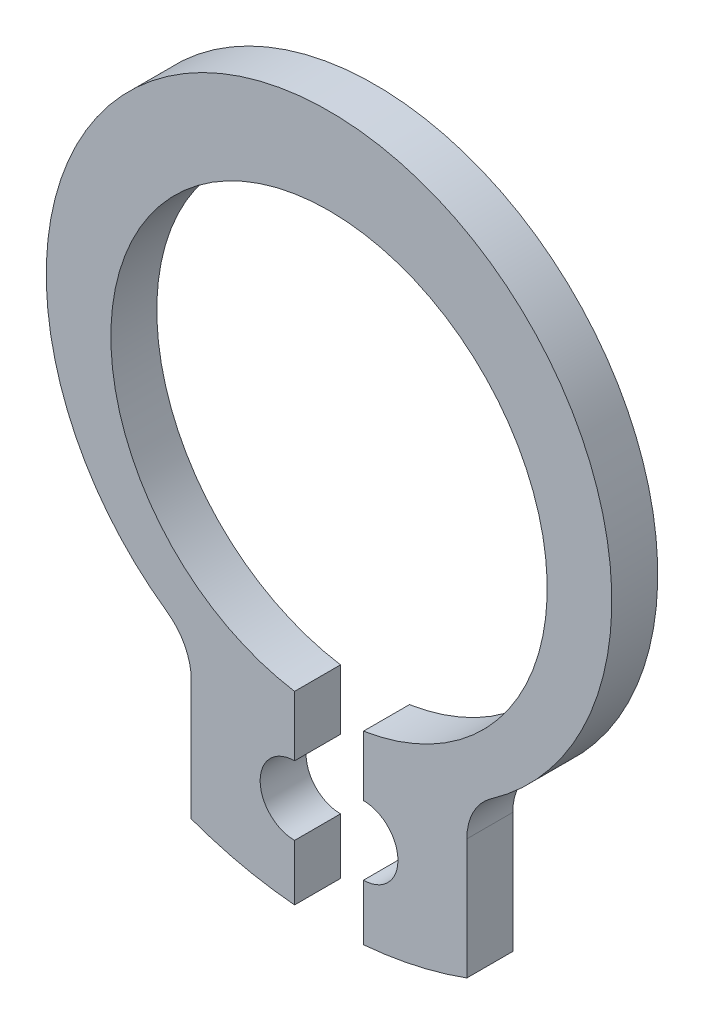
ISO-10303-21;
HEADER;
FILE_DESCRIPTION(('STEP AP214'),'2;1');
FILE_NAME('part.step','',(''),(''),'','','');
FILE_SCHEMA(('AUTOMOTIVE_DESIGN { 1 0 10303 214 1 1 1 1 }'));
ENDSEC;
DATA;
#1=APPLICATION_CONTEXT('core data for automotive mechanical design processes');
#2=APPLICATION_PROTOCOL_DEFINITION('international standard','automotive_design',2000,#1);
#3=PRODUCT_CONTEXT('',#1,'mechanical');
#4=PRODUCT('Part','Part','',(#3));
#5=PRODUCT_RELATED_PRODUCT_CATEGORY('part','',(#4));
#6=PRODUCT_DEFINITION_FORMATION('','',#4);
#7=PRODUCT_DEFINITION_CONTEXT('part definition',#1,'design');
#8=PRODUCT_DEFINITION('design','',#6,#7);
#9=PRODUCT_DEFINITION_SHAPE('','',#8);
#10=(LENGTH_UNIT() NAMED_UNIT(*) SI_UNIT(.MILLI.,.METRE.));
#11=(NAMED_UNIT(*) PLANE_ANGLE_UNIT() SI_UNIT($,.RADIAN.));
#12=(NAMED_UNIT(*) SI_UNIT($,.STERADIAN.) SOLID_ANGLE_UNIT());
#13=UNCERTAINTY_MEASURE_WITH_UNIT(LENGTH_MEASURE(1.E-05),#10,'distance_accuracy_value','');
#14=(GEOMETRIC_REPRESENTATION_CONTEXT(3) GLOBAL_UNCERTAINTY_ASSIGNED_CONTEXT((#13)) GLOBAL_UNIT_ASSIGNED_CONTEXT((#10,
#11,#12)) REPRESENTATION_CONTEXT('',''));
#15=CARTESIAN_POINT('',(0.,0.,0.));
#16=DIRECTION('',(0.,0.,1.));
#17=DIRECTION('',(1.,0.,0.));
#18=AXIS2_PLACEMENT_3D('',#15,#16,#17);
#19=CARTESIAN_POINT('',(0.6,-4.775,-0.8));
#20=DIRECTION('',(1.,0.,0.));
#21=DIRECTION('',(0.,0.,-1.));
#22=AXIS2_PLACEMENT_3D('',#19,#20,#21);
#23=PLANE('',#22);
#24=DIRECTION('',(0.,1.,0.));
#25=VECTOR('',#24,1.);
#26=CARTESIAN_POINT('',(0.6,0.375,0.));
#27=LINE('',#26,#25);
#28=CARTESIAN_POINT('',(0.6,-4.8,0.));
#29=VERTEX_POINT('',#28);
#30=CARTESIAN_POINT('',(0.6,-3.75233260785874,0.));
#31=VERTEX_POINT('',#30);
#32=EDGE_CURVE('E470',#29,#31,#27,.T.);
#33=ORIENTED_EDGE('',*,*,#32,.F.);
#34=DIRECTION('',(0.,0.,1.));
#35=VECTOR('',#34,1.);
#36=CARTESIAN_POINT('',(0.6,-4.8,-0.8));
#37=LINE('',#36,#35);
#38=CARTESIAN_POINT('',(0.6,-4.8,0.8));
#39=VERTEX_POINT('',#38);
#40=EDGE_CURVE('E145',#29,#39,#37,.T.);
#41=ORIENTED_EDGE('',*,*,#40,.T.);
#42=DIRECTION('',(0.,1.,0.));
#43=VECTOR('',#42,1.);
#44=CARTESIAN_POINT('',(0.6,0.375,0.8));
#45=LINE('',#44,#43);
#46=CARTESIAN_POINT('',(0.6,-3.75233260785874,0.8));
#47=VERTEX_POINT('',#46);
#48=EDGE_CURVE('E155',#39,#47,#45,.T.);
#49=ORIENTED_EDGE('',*,*,#48,.T.);
#50=DIRECTION('',(0.,0.,1.));
#51=VECTOR('',#50,1.);
#52=CARTESIAN_POINT('',(0.6,-3.75233260785874,-0.8));
#53=LINE('',#52,#51);
#54=EDGE_CURVE('E231',#31,#47,#53,.T.);
#55=ORIENTED_EDGE('',*,*,#54,.F.);
#56=EDGE_LOOP('',(#33,#41,#49,#55));
#57=FACE_BOUND('',#56,.T.);
#58=ADVANCED_FACE('F34',(#57),#23,.F.);
#59=CARTESIAN_POINT('',(-0.6,-4.775,-0.8));
#60=DIRECTION('',(-1.,0.,0.));
#61=DIRECTION('',(0.,0.,1.));
#62=AXIS2_PLACEMENT_3D('',#59,#60,#61);
#63=PLANE('',#62);
#64=DIRECTION('',(0.,-1.,0.));
#65=VECTOR('',#64,1.);
#66=CARTESIAN_POINT('',(-0.6,0.375,0.));
#67=LINE('',#66,#65);
#68=CARTESIAN_POINT('',(-0.6,-6.,0.));
#69=VERTEX_POINT('',#68);
#70=CARTESIAN_POINT('',(-0.6,-6.97423830966508,0.));
#71=VERTEX_POINT('',#70);
#72=EDGE_CURVE('E167',#69,#71,#67,.T.);
#73=ORIENTED_EDGE('',*,*,#72,.F.);
#74=DIRECTION('',(0.,0.,1.));
#75=VECTOR('',#74,1.);
#76=CARTESIAN_POINT('',(-0.6,-6.,-0.8));
#77=LINE('',#76,#75);
#78=CARTESIAN_POINT('',(-0.6,-6.,0.8));
#79=VERTEX_POINT('',#78);
#80=EDGE_CURVE('E146',#69,#79,#77,.T.);
#81=ORIENTED_EDGE('',*,*,#80,.T.);
#82=DIRECTION('',(0.,-1.,0.));
#83=VECTOR('',#82,1.);
#84=CARTESIAN_POINT('',(-0.6,0.375,0.8));
#85=LINE('',#84,#83);
#86=CARTESIAN_POINT('',(-0.6,-6.97423830966508,0.8));
#87=VERTEX_POINT('',#86);
#88=EDGE_CURVE('E178',#79,#87,#85,.T.);
#89=ORIENTED_EDGE('',*,*,#88,.T.);
#90=DIRECTION('',(0.,0.,-1.));
#91=VECTOR('',#90,1.);
#92=CARTESIAN_POINT('',(-0.6,-6.97423830966508,0.8));
#93=LINE('',#92,#91);
#94=EDGE_CURVE('E183',#71,#87,#93,.F.);
#95=ORIENTED_EDGE('',*,*,#94,.F.);
#96=EDGE_LOOP('',(#73,#81,#89,#95));
#97=FACE_BOUND('',#96,.T.);
#98=ADVANCED_FACE('F348',(#97),#63,.F.);
#99=CARTESIAN_POINT('',(0.,0.,0.8));
#100=DIRECTION('',(0.,0.,-1.));
#101=DIRECTION('',(-1.,0.,0.));
#102=AXIS2_PLACEMENT_3D('',#99,#100,#101);
#103=CYLINDRICAL_SURFACE('',#102,7.);
#104=CARTESIAN_POINT('',(0.,0.,0.));
#105=DIRECTION('',(0.,0.,1.));
#106=DIRECTION('',(1.,0.,0.));
#107=AXIS2_PLACEMENT_3D('',#104,#105,#106);
#108=CIRCLE('',#107,7.);
#109=CARTESIAN_POINT('',(-2.4,-6.57571288910944,0.));
#110=VERTEX_POINT('',#109);
#111=EDGE_CURVE('E202',#110,#71,#108,.T.);
#112=ORIENTED_EDGE('',*,*,#111,.T.);
#113=ORIENTED_EDGE('',*,*,#94,.T.);
#114=CARTESIAN_POINT('',(0.,0.,0.8));
#115=DIRECTION('',(0.,0.,1.));
#116=DIRECTION('',(1.,0.,0.));
#117=AXIS2_PLACEMENT_3D('',#114,#115,#116);
#118=CIRCLE('',#117,7.);
#119=CARTESIAN_POINT('',(-2.4,-6.57571288910944,0.8));
#120=VERTEX_POINT('',#119);
#121=EDGE_CURVE('E218',#120,#87,#118,.T.);
#122=ORIENTED_EDGE('',*,*,#121,.F.);
#123=DIRECTION('',(0.,0.,-1.));
#124=VECTOR('',#123,1.);
#125=CARTESIAN_POINT('',(-2.4,-6.57571288910944,0.8));
#126=LINE('',#125,#124);
#127=EDGE_CURVE('E228',#120,#110,#126,.T.);
#128=ORIENTED_EDGE('',*,*,#127,.T.);
#129=EDGE_LOOP('',(#112,#113,#122,#128));
#130=FACE_BOUND('',#129,.T.);
#131=ADVANCED_FACE('F386',(#130),#103,.T.);
#132=CARTESIAN_POINT('',(2.4,-6.57571288910944,0.8));
#133=DIRECTION('',(-1.,0.,0.));
#134=DIRECTION('',(0.,-1.,0.));
#135=AXIS2_PLACEMENT_3D('',#132,#133,#134);
#136=PLANE('',#135);
#137=DIRECTION('',(0.,1.,0.));
#138=VECTOR('',#137,1.);
#139=CARTESIAN_POINT('',(2.4,-6.57571288910944,0.));
#140=LINE('',#139,#138);
#141=CARTESIAN_POINT('',(2.4,-6.57571288910944,0.));
#142=VERTEX_POINT('',#141);
#143=CARTESIAN_POINT('',(2.4,-4.47738343497296,0.));
#144=VERTEX_POINT('',#143);
#145=EDGE_CURVE('E192',#142,#144,#140,.T.);
#146=ORIENTED_EDGE('',*,*,#145,.T.);
#147=DIRECTION('',(0.,0.,1.));
#148=VECTOR('',#147,1.);
#149=CARTESIAN_POINT('',(2.4,-4.47738343497296,0.8));
#150=LINE('',#149,#148);
#151=CARTESIAN_POINT('',(2.4,-4.47738343497296,0.8));
#152=VERTEX_POINT('',#151);
#153=EDGE_CURVE('E49',#144,#152,#150,.T.);
#154=ORIENTED_EDGE('',*,*,#153,.T.);
#155=DIRECTION('',(0.,1.,0.));
#156=VECTOR('',#155,1.);
#157=CARTESIAN_POINT('',(2.4,-6.57571288910944,0.8));
#158=LINE('',#157,#156);
#159=CARTESIAN_POINT('',(2.4,-6.57571288910944,0.8));
#160=VERTEX_POINT('',#159);
#161=EDGE_CURVE('E206',#160,#152,#158,.T.);
#162=ORIENTED_EDGE('',*,*,#161,.F.);
#163=DIRECTION('',(0.,0.,-1.));
#164=VECTOR('',#163,1.);
#165=CARTESIAN_POINT('',(2.4,-6.57571288910944,0.8));
#166=LINE('',#165,#164);
#167=EDGE_CURVE('E222',#160,#142,#166,.T.);
#168=ORIENTED_EDGE('',*,*,#167,.T.);
#169=EDGE_LOOP('',(#146,#154,#162,#168));
#170=FACE_BOUND('',#169,.T.);
#171=ADVANCED_FACE('F282',(#170),#136,.F.);
#172=CARTESIAN_POINT('',(0.,0.375,0.8));
#173=DIRECTION('',(0.,0.,-1.));
#174=DIRECTION('',(-1.,0.,0.));
#175=AXIS2_PLACEMENT_3D('',#172,#173,#174);
#176=CYLINDRICAL_SURFACE('',#175,4.925);
#177=CARTESIAN_POINT('',(0.,0.375,0.));
#178=DIRECTION('',(0.,0.,1.));
#179=DIRECTION('',(1.,0.,0.));
#180=AXIS2_PLACEMENT_3D('',#177,#178,#179);
#181=CIRCLE('',#180,4.925);
#182=CARTESIAN_POINT('',(2.82616033755274,-3.6584157666231,0.));
#183=VERTEX_POINT('',#182);
#184=CARTESIAN_POINT('',(-2.82616033755274,-3.65841576662309,0.));
#185=VERTEX_POINT('',#184);
#186=EDGE_CURVE('E193',#183,#185,#181,.T.);
#187=ORIENTED_EDGE('',*,*,#186,.T.);
#188=DIRECTION('',(0.,0.,-1.));
#189=VECTOR('',#188,1.);
#190=CARTESIAN_POINT('',(-2.82616033755274,-3.6584157666231,0.8));
#191=LINE('',#190,#189);
#192=CARTESIAN_POINT('',(-2.82616033755274,-3.65841576662309,0.8));
#193=VERTEX_POINT('',#192);
#194=EDGE_CURVE('E257',#185,#193,#191,.F.);
#195=ORIENTED_EDGE('',*,*,#194,.T.);
#196=CARTESIAN_POINT('',(0.,0.375,0.8));
#197=DIRECTION('',(0.,0.,1.));
#198=DIRECTION('',(1.,0.,0.));
#199=AXIS2_PLACEMENT_3D('',#196,#197,#198);
#200=CIRCLE('',#199,4.925);
#201=CARTESIAN_POINT('',(2.82616033755274,-3.6584157666231,0.8));
#202=VERTEX_POINT('',#201);
#203=EDGE_CURVE('E209',#202,#193,#200,.T.);
#204=ORIENTED_EDGE('',*,*,#203,.F.);
#205=DIRECTION('',(0.,0.,-1.));
#206=VECTOR('',#205,1.);
#207=CARTESIAN_POINT('',(2.82616033755274,-3.6584157666231,0.8));
#208=LINE('',#207,#206);
#209=EDGE_CURVE('E254',#202,#183,#208,.T.);
#210=ORIENTED_EDGE('',*,*,#209,.T.);
#211=EDGE_LOOP('',(#187,#195,#204,#210));
#212=FACE_BOUND('',#211,.T.);
#213=ADVANCED_FACE('F277',(#212),#176,.T.);
#214=CARTESIAN_POINT('',(-2.4,-6.57571288910944,0.8));
#215=DIRECTION('',(-1.,0.,0.));
#216=DIRECTION('',(0.,-1.,0.));
#217=AXIS2_PLACEMENT_3D('',#214,#215,#216);
#218=PLANE('',#217);
#219=DIRECTION('',(0.,1.,0.));
#220=VECTOR('',#219,1.);
#221=CARTESIAN_POINT('',(-2.4,-6.57571288910944,0.8));
#222=LINE('',#221,#220);
#223=CARTESIAN_POINT('',(-2.4,-4.47738343497296,0.8));
#224=VERTEX_POINT('',#223);
#225=EDGE_CURVE('E213',#120,#224,#222,.T.);
#226=ORIENTED_EDGE('',*,*,#225,.T.);
#227=DIRECTION('',(0.,0.,-1.));
#228=VECTOR('',#227,1.);
#229=CARTESIAN_POINT('',(-2.4,-4.47738343497296,0.8));
#230=LINE('',#229,#228);
#231=CARTESIAN_POINT('',(-2.4,-4.47738343497296,0.));
#232=VERTEX_POINT('',#231);
#233=EDGE_CURVE('E251',#224,#232,#230,.T.);
#234=ORIENTED_EDGE('',*,*,#233,.T.);
#235=DIRECTION('',(0.,1.,0.));
#236=VECTOR('',#235,1.);
#237=CARTESIAN_POINT('',(-2.4,-6.57571288910944,0.));
#238=LINE('',#237,#236);
#239=EDGE_CURVE('E197',#110,#232,#238,.T.);
#240=ORIENTED_EDGE('',*,*,#239,.F.);
#241=ORIENTED_EDGE('',*,*,#127,.F.);
#242=EDGE_LOOP('',(#226,#234,#240,#241));
#243=FACE_BOUND('',#242,.T.);
#244=ADVANCED_FACE('F270',(#243),#218,.T.);
#245=CARTESIAN_POINT('',(0.6,-6.97423830966508,0.8));
#246=VERTEX_POINT('',#245);
#247=EDGE_CURVE('E217',#246,#160,#118,.T.);
#248=ORIENTED_EDGE('',*,*,#247,.F.);
#249=DIRECTION('',(0.,0.,-1.));
#250=VECTOR('',#249,1.);
#251=CARTESIAN_POINT('',(0.6,-6.97423830966508,0.8));
#252=LINE('',#251,#250);
#253=CARTESIAN_POINT('',(0.6,-6.97423830966508,0.));
#254=VERTEX_POINT('',#253);
#255=EDGE_CURVE('E161',#246,#254,#252,.T.);
#256=ORIENTED_EDGE('',*,*,#255,.T.);
#257=EDGE_CURVE('E201',#254,#142,#108,.T.);
#258=ORIENTED_EDGE('',*,*,#257,.T.);
#259=ORIENTED_EDGE('',*,*,#167,.F.);
#260=EDGE_LOOP('',(#248,#256,#258,#259));
#261=FACE_BOUND('',#260,.T.);
#262=ADVANCED_FACE('F293',(#261),#103,.T.);
#263=CARTESIAN_POINT('',(0.,0.375,0.8));
#264=DIRECTION('',(0.,0.,1.));
#265=DIRECTION('',(1.,0.,0.));
#266=AXIS2_PLACEMENT_3D('',#263,#264,#265);
#267=PLANE('',#266);
#268=CARTESIAN_POINT('',(0.6,-5.4,0.8));
#269=DIRECTION('',(0.,0.,1.));
#270=DIRECTION('',(1.,0.,0.));
#271=AXIS2_PLACEMENT_3D('',#268,#269,#270);
#272=CIRCLE('',#271,0.6);
#273=CARTESIAN_POINT('',(0.6,-6.,0.8));
#274=VERTEX_POINT('',#273);
#275=EDGE_CURVE('E137',#274,#39,#272,.T.);
#276=ORIENTED_EDGE('',*,*,#275,.F.);
#277=EDGE_CURVE('E152',#246,#274,#45,.T.);
#278=ORIENTED_EDGE('',*,*,#277,.F.);
#279=ORIENTED_EDGE('',*,*,#247,.T.);
#280=ORIENTED_EDGE('',*,*,#161,.T.);
#281=CARTESIAN_POINT('',(3.4,-4.47738343497296,0.8));
#282=DIRECTION('',(0.,0.,1.));
#283=DIRECTION('',(1.,0.,0.));
#284=AXIS2_PLACEMENT_3D('',#281,#282,#283);
#285=CIRCLE('',#284,1.);
#286=EDGE_CURVE('E11',#152,#202,#285,.F.);
#287=ORIENTED_EDGE('',*,*,#286,.T.);
#288=ORIENTED_EDGE('',*,*,#203,.T.);
#289=CARTESIAN_POINT('',(-3.4,-4.47738343497296,0.8));
#290=DIRECTION('',(0.,0.,1.));
#291=DIRECTION('',(1.,0.,0.));
#292=AXIS2_PLACEMENT_3D('',#289,#290,#291);
#293=CIRCLE('',#292,1.);
#294=EDGE_CURVE('E262',#193,#224,#293,.F.);
#295=ORIENTED_EDGE('',*,*,#294,.T.);
#296=ORIENTED_EDGE('',*,*,#225,.F.);
#297=ORIENTED_EDGE('',*,*,#121,.T.);
#298=ORIENTED_EDGE('',*,*,#88,.F.);
#299=CARTESIAN_POINT('',(-0.6,-5.4,0.8));
#300=DIRECTION('',(0.,0.,1.));
#301=DIRECTION('',(1.,0.,0.));
#302=AXIS2_PLACEMENT_3D('',#299,#300,#301);
#303=CIRCLE('',#302,0.6);
#304=CARTESIAN_POINT('',(-0.6,-4.8,0.8));
#305=VERTEX_POINT('',#304);
#306=EDGE_CURVE('E472',#305,#79,#303,.T.);
#307=ORIENTED_EDGE('',*,*,#306,.F.);
#308=CARTESIAN_POINT('',(-0.6,-3.75233260785874,0.8));
#309=VERTEX_POINT('',#308);
#310=EDGE_CURVE('E179',#309,#305,#85,.T.);
#311=ORIENTED_EDGE('',*,*,#310,.F.);
#312=CARTESIAN_POINT('',(0.,0.,0.8));
#313=DIRECTION('',(0.,0.,1.));
#314=DIRECTION('',(1.,0.,0.));
#315=AXIS2_PLACEMENT_3D('',#312,#313,#314);
#316=CIRCLE('',#315,3.8);
#317=EDGE_CURVE('E188',#47,#309,#316,.T.);
#318=ORIENTED_EDGE('',*,*,#317,.F.);
#319=ORIENTED_EDGE('',*,*,#48,.F.);
#320=EDGE_LOOP('',(#276,#278,#279,#280,#287,#288,#295,#296,#297,#298,#307,#311,#318,#319));
#321=FACE_BOUND('',#320,.T.);
#322=ADVANCED_FACE('F151',(#321),#267,.T.);
#323=CARTESIAN_POINT('',(0.,0.375,0.));
#324=DIRECTION('',(0.,0.,1.));
#325=DIRECTION('',(1.,0.,0.));
#326=AXIS2_PLACEMENT_3D('',#323,#324,#325);
#327=PLANE('',#326);
#328=CARTESIAN_POINT('',(0.6,-6.,0.));
#329=VERTEX_POINT('',#328);
#330=EDGE_CURVE('E170',#254,#329,#27,.T.);
#331=ORIENTED_EDGE('',*,*,#330,.T.);
#332=CARTESIAN_POINT('',(0.6,-5.4,0.));
#333=DIRECTION('',(0.,0.,1.));
#334=DIRECTION('',(1.,0.,0.));
#335=AXIS2_PLACEMENT_3D('',#332,#333,#334);
#336=CIRCLE('',#335,0.6);
#337=EDGE_CURVE('E140',#329,#29,#336,.T.);
#338=ORIENTED_EDGE('',*,*,#337,.T.);
#339=ORIENTED_EDGE('',*,*,#32,.T.);
#340=CARTESIAN_POINT('',(0.,0.,0.));
#341=DIRECTION('',(0.,0.,1.));
#342=DIRECTION('',(1.,0.,0.));
#343=AXIS2_PLACEMENT_3D('',#340,#341,#342);
#344=CIRCLE('',#343,3.8);
#345=CARTESIAN_POINT('',(-0.6,-3.75233260785874,0.));
#346=VERTEX_POINT('',#345);
#347=EDGE_CURVE('E187',#31,#346,#344,.T.);
#348=ORIENTED_EDGE('',*,*,#347,.T.);
#349=CARTESIAN_POINT('',(-0.6,-4.8,0.));
#350=VERTEX_POINT('',#349);
#351=EDGE_CURVE('E174',#346,#350,#67,.T.);
#352=ORIENTED_EDGE('',*,*,#351,.T.);
#353=CARTESIAN_POINT('',(-0.6,-5.4,0.));
#354=DIRECTION('',(0.,0.,1.));
#355=DIRECTION('',(1.,0.,0.));
#356=AXIS2_PLACEMENT_3D('',#353,#354,#355);
#357=CIRCLE('',#356,0.6);
#358=EDGE_CURVE('E157',#350,#69,#357,.T.);
#359=ORIENTED_EDGE('',*,*,#358,.T.);
#360=ORIENTED_EDGE('',*,*,#72,.T.);
#361=ORIENTED_EDGE('',*,*,#111,.F.);
#362=ORIENTED_EDGE('',*,*,#239,.T.);
#363=CARTESIAN_POINT('',(-3.4,-4.47738343497296,0.));
#364=DIRECTION('',(0.,0.,1.));
#365=DIRECTION('',(1.,0.,0.));
#366=AXIS2_PLACEMENT_3D('',#363,#364,#365);
#367=CIRCLE('',#366,1.);
#368=EDGE_CURVE('E260',#232,#185,#367,.T.);
#369=ORIENTED_EDGE('',*,*,#368,.T.);
#370=ORIENTED_EDGE('',*,*,#186,.F.);
#371=CARTESIAN_POINT('',(3.4,-4.47738343497296,0.));
#372=DIRECTION('',(0.,0.,1.));
#373=DIRECTION('',(1.,0.,0.));
#374=AXIS2_PLACEMENT_3D('',#371,#372,#373);
#375=CIRCLE('',#374,1.);
#376=EDGE_CURVE('E42',#183,#144,#375,.T.);
#377=ORIENTED_EDGE('',*,*,#376,.T.);
#378=ORIENTED_EDGE('',*,*,#145,.F.);
#379=ORIENTED_EDGE('',*,*,#257,.F.);
#380=EDGE_LOOP('',(#331,#338,#339,#348,#352,#359,#360,#361,#362,#369,#370,#377,#378,#379));
#381=FACE_BOUND('',#380,.T.);
#382=ADVANCED_FACE('F274',(#381),#327,.F.);
#383=CARTESIAN_POINT('',(0.,0.,-0.8));
#384=DIRECTION('',(0.,0.,1.));
#385=DIRECTION('',(0.,1.,0.));
#386=AXIS2_PLACEMENT_3D('',#383,#384,#385);
#387=CYLINDRICAL_SURFACE('',#386,3.8);
#388=ORIENTED_EDGE('',*,*,#317,.T.);
#389=DIRECTION('',(0.,0.,1.));
#390=VECTOR('',#389,1.);
#391=CARTESIAN_POINT('',(-0.6,-3.75233260785874,-0.8));
#392=LINE('',#391,#390);
#393=EDGE_CURVE('E238',#309,#346,#392,.F.);
#394=ORIENTED_EDGE('',*,*,#393,.T.);
#395=ORIENTED_EDGE('',*,*,#347,.F.);
#396=ORIENTED_EDGE('',*,*,#54,.T.);
#397=EDGE_LOOP('',(#388,#394,#395,#396));
#398=FACE_BOUND('',#397,.T.);
#399=ADVANCED_FACE('F314',(#398),#387,.F.);
#400=ORIENTED_EDGE('',*,*,#277,.T.);
#401=DIRECTION('',(0.,0.,1.));
#402=VECTOR('',#401,1.);
#403=CARTESIAN_POINT('',(0.6,-6.,-0.8));
#404=LINE('',#403,#402);
#405=EDGE_CURVE('E134',#274,#329,#404,.F.);
#406=ORIENTED_EDGE('',*,*,#405,.T.);
#407=ORIENTED_EDGE('',*,*,#330,.F.);
#408=ORIENTED_EDGE('',*,*,#255,.F.);
#409=EDGE_LOOP('',(#400,#406,#407,#408));
#410=FACE_BOUND('',#409,.T.);
#411=ADVANCED_FACE('F159',(#410),#23,.F.);
#412=ORIENTED_EDGE('',*,*,#310,.T.);
#413=DIRECTION('',(0.,0.,1.));
#414=VECTOR('',#413,1.);
#415=CARTESIAN_POINT('',(-0.6,-4.8,-0.8));
#416=LINE('',#415,#414);
#417=EDGE_CURVE('E242',#305,#350,#416,.F.);
#418=ORIENTED_EDGE('',*,*,#417,.T.);
#419=ORIENTED_EDGE('',*,*,#351,.F.);
#420=ORIENTED_EDGE('',*,*,#393,.F.);
#421=EDGE_LOOP('',(#412,#418,#419,#420));
#422=FACE_BOUND('',#421,.T.);
#423=ADVANCED_FACE('F335',(#422),#63,.F.);
#424=CARTESIAN_POINT('',(-0.6,-5.4,-0.8));
#425=DIRECTION('',(0.,0.,1.));
#426=DIRECTION('',(0.,1.,0.));
#427=AXIS2_PLACEMENT_3D('',#424,#425,#426);
#428=CYLINDRICAL_SURFACE('',#427,0.6);
#429=ORIENTED_EDGE('',*,*,#358,.F.);
#430=ORIENTED_EDGE('',*,*,#417,.F.);
#431=ORIENTED_EDGE('',*,*,#306,.T.);
#432=ORIENTED_EDGE('',*,*,#80,.F.);
#433=EDGE_LOOP('',(#429,#430,#431,#432));
#434=FACE_BOUND('',#433,.T.);
#435=ADVANCED_FACE('F345',(#434),#428,.F.);
#436=CARTESIAN_POINT('',(0.6,-5.4,-0.8));
#437=DIRECTION('',(0.,0.,1.));
#438=DIRECTION('',(0.,1.,0.));
#439=AXIS2_PLACEMENT_3D('',#436,#437,#438);
#440=CYLINDRICAL_SURFACE('',#439,0.6);
#441=ORIENTED_EDGE('',*,*,#337,.F.);
#442=ORIENTED_EDGE('',*,*,#405,.F.);
#443=ORIENTED_EDGE('',*,*,#275,.T.);
#444=ORIENTED_EDGE('',*,*,#40,.F.);
#445=EDGE_LOOP('',(#441,#442,#443,#444));
#446=FACE_BOUND('',#445,.T.);
#447=ADVANCED_FACE('F136',(#446),#440,.F.);
#448=CARTESIAN_POINT('',(-3.4,-4.47738343497296,0.8));
#449=DIRECTION('',(0.,0.,-1.));
#450=DIRECTION('',(-1.,0.,0.));
#451=AXIS2_PLACEMENT_3D('',#448,#449,#450);
#452=CYLINDRICAL_SURFACE('',#451,1.);
#453=ORIENTED_EDGE('',*,*,#294,.F.);
#454=ORIENTED_EDGE('',*,*,#194,.F.);
#455=ORIENTED_EDGE('',*,*,#368,.F.);
#456=ORIENTED_EDGE('',*,*,#233,.F.);
#457=EDGE_LOOP('',(#453,#454,#455,#456));
#458=FACE_BOUND('',#457,.T.);
#459=ADVANCED_FACE('F273',(#458),#452,.F.);
#460=CARTESIAN_POINT('',(3.4,-4.47738343497296,0.8));
#461=DIRECTION('',(0.,0.,-1.));
#462=DIRECTION('',(-1.,0.,0.));
#463=AXIS2_PLACEMENT_3D('',#460,#461,#462);
#464=CYLINDRICAL_SURFACE('',#463,1.);
#465=ORIENTED_EDGE('',*,*,#286,.F.);
#466=ORIENTED_EDGE('',*,*,#153,.F.);
#467=ORIENTED_EDGE('',*,*,#376,.F.);
#468=ORIENTED_EDGE('',*,*,#209,.F.);
#469=EDGE_LOOP('',(#465,#466,#467,#468));
#470=FACE_BOUND('',#469,.T.);
#471=ADVANCED_FACE('F36',(#470),#464,.F.);
#472=CLOSED_SHELL('',(#58,#98,#131,#171,#213,#244,#262,#322,#382,#399,#411,#423,#435,#447,#459,#471));
#473=MANIFOLD_SOLID_BREP('B2',#472);
#474=ADVANCED_BREP_SHAPE_REPRESENTATION('',(#18,#473),#14);
#475=SHAPE_DEFINITION_REPRESENTATION(#9,#474);
ENDSEC;
END-ISO-10303-21;
